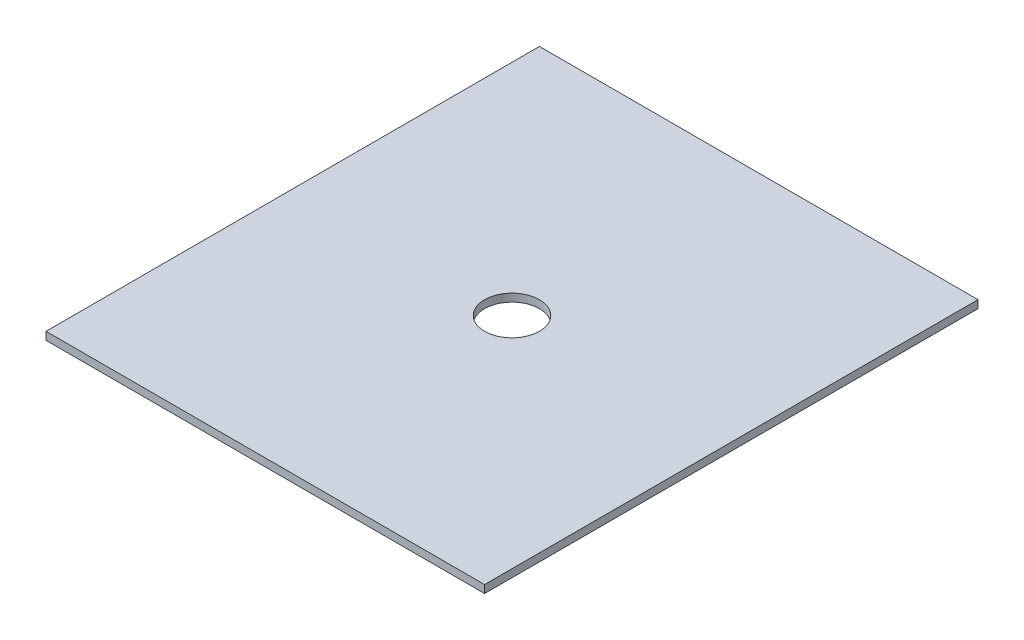
ISO-10303-21;
HEADER;
FILE_DESCRIPTION(('STEP AP214'),'2;1');
FILE_NAME('part.step','',(''),(''),'','','');
FILE_SCHEMA(('AUTOMOTIVE_DESIGN { 1 0 10303 214 1 1 1 1 }'));
ENDSEC;
DATA;
#1=APPLICATION_CONTEXT('core data for automotive mechanical design processes');
#2=APPLICATION_PROTOCOL_DEFINITION('international standard','automotive_design',2000,#1);
#3=PRODUCT_CONTEXT('',#1,'mechanical');
#4=PRODUCT('Part','Part','',(#3));
#5=PRODUCT_RELATED_PRODUCT_CATEGORY('part','',(#4));
#6=PRODUCT_DEFINITION_FORMATION('','',#4);
#7=PRODUCT_DEFINITION_CONTEXT('part definition',#1,'design');
#8=PRODUCT_DEFINITION('design','',#6,#7);
#9=PRODUCT_DEFINITION_SHAPE('','',#8);
#10=(LENGTH_UNIT() NAMED_UNIT(*) SI_UNIT(.MILLI.,.METRE.));
#11=(NAMED_UNIT(*) PLANE_ANGLE_UNIT() SI_UNIT($,.RADIAN.));
#12=(NAMED_UNIT(*) SI_UNIT($,.STERADIAN.) SOLID_ANGLE_UNIT());
#13=UNCERTAINTY_MEASURE_WITH_UNIT(LENGTH_MEASURE(1.E-05),#10,'distance_accuracy_value','');
#14=(GEOMETRIC_REPRESENTATION_CONTEXT(3) GLOBAL_UNCERTAINTY_ASSIGNED_CONTEXT((#13)) GLOBAL_UNIT_ASSIGNED_CONTEXT((#10,
#11,#12)) REPRESENTATION_CONTEXT('',''));
#15=CARTESIAN_POINT('',(0.,0.,0.));
#16=DIRECTION('',(0.,0.,1.));
#17=DIRECTION('',(1.,0.,0.));
#18=AXIS2_PLACEMENT_3D('',#15,#16,#17);
#19=CARTESIAN_POINT('',(0.,6.35,0.));
#20=DIRECTION('',(0.,-1.,0.));
#21=DIRECTION('',(0.,0.,-1.));
#22=AXIS2_PLACEMENT_3D('',#19,#20,#21);
#23=PLANE('',#22);
#24=DIRECTION('',(0.,0.,1.));
#25=VECTOR('',#24,1.);
#26=CARTESIAN_POINT('',(0.,6.35,0.));
#27=LINE('',#26,#25);
#28=CARTESIAN_POINT('',(0.,6.35,-400.05));
#29=VERTEX_POINT('',#28);
#30=CARTESIAN_POINT('',(0.,6.35,0.));
#31=VERTEX_POINT('',#30);
#32=EDGE_CURVE('E89',#29,#31,#27,.T.);
#33=ORIENTED_EDGE('',*,*,#32,.T.);
#34=DIRECTION('',(1.,0.,0.));
#35=VECTOR('',#34,1.);
#36=CARTESIAN_POINT('',(0.,6.35,0.));
#37=LINE('',#36,#35);
#38=CARTESIAN_POINT('',(355.6,6.35,0.));
#39=VERTEX_POINT('',#38);
#40=EDGE_CURVE('E84',#31,#39,#37,.T.);
#41=ORIENTED_EDGE('',*,*,#40,.T.);
#42=DIRECTION('',(0.,0.,-1.));
#43=VECTOR('',#42,1.);
#44=CARTESIAN_POINT('',(355.6,6.35,0.));
#45=LINE('',#44,#43);
#46=CARTESIAN_POINT('',(355.6,6.35,-400.05));
#47=VERTEX_POINT('',#46);
#48=EDGE_CURVE('E87',#39,#47,#45,.T.);
#49=ORIENTED_EDGE('',*,*,#48,.T.);
#50=DIRECTION('',(-1.,0.,0.));
#51=VECTOR('',#50,1.);
#52=CARTESIAN_POINT('',(0.,6.35,-400.05));
#53=LINE('',#52,#51);
#54=EDGE_CURVE('E54',#47,#29,#53,.T.);
#55=ORIENTED_EDGE('',*,*,#54,.T.);
#56=EDGE_LOOP('',(#33,#41,#49,#55));
#57=FACE_BOUND('',#56,.T.);
#58=CARTESIAN_POINT('',(177.8,6.35,-200.025));
#59=DIRECTION('',(0.,1.,0.));
#60=DIRECTION('',(0.,0.,1.));
#61=AXIS2_PLACEMENT_3D('',#58,#59,#60);
#62=CIRCLE('',#61,22.225);
#63=CARTESIAN_POINT('',(177.8,6.35,-177.8));
#64=VERTEX_POINT('',#63);
#65=EDGE_CURVE('E104',#64,#64,#62,.T.);
#66=ORIENTED_EDGE('',*,*,#65,.F.);
#67=EDGE_LOOP('',(#66));
#68=FACE_BOUND('',#67,.T.);
#69=ADVANCED_FACE('F37',(#57,#68),#23,.F.);
#70=CARTESIAN_POINT('',(0.,0.,0.));
#71=DIRECTION('',(0.,-1.,0.));
#72=DIRECTION('',(0.,0.,-1.));
#73=AXIS2_PLACEMENT_3D('',#70,#71,#72);
#74=PLANE('',#73);
#75=DIRECTION('',(0.,0.,1.));
#76=VECTOR('',#75,1.);
#77=CARTESIAN_POINT('',(0.,0.,0.));
#78=LINE('',#77,#76);
#79=CARTESIAN_POINT('',(0.,0.,-400.05));
#80=VERTEX_POINT('',#79);
#81=CARTESIAN_POINT('',(0.,0.,0.));
#82=VERTEX_POINT('',#81);
#83=EDGE_CURVE('E101',#80,#82,#78,.T.);
#84=ORIENTED_EDGE('',*,*,#83,.F.);
#85=DIRECTION('',(-1.,0.,0.));
#86=VECTOR('',#85,1.);
#87=CARTESIAN_POINT('',(0.,0.,-400.05));
#88=LINE('',#87,#86);
#89=CARTESIAN_POINT('',(355.6,0.,-400.05));
#90=VERTEX_POINT('',#89);
#91=EDGE_CURVE('E77',#90,#80,#88,.T.);
#92=ORIENTED_EDGE('',*,*,#91,.F.);
#93=DIRECTION('',(0.,0.,-1.));
#94=VECTOR('',#93,1.);
#95=CARTESIAN_POINT('',(355.6,0.,0.));
#96=LINE('',#95,#94);
#97=CARTESIAN_POINT('',(355.6,0.,0.));
#98=VERTEX_POINT('',#97);
#99=EDGE_CURVE('E71',#98,#90,#96,.T.);
#100=ORIENTED_EDGE('',*,*,#99,.F.);
#101=DIRECTION('',(1.,0.,0.));
#102=VECTOR('',#101,1.);
#103=CARTESIAN_POINT('',(0.,0.,0.));
#104=LINE('',#103,#102);
#105=EDGE_CURVE('E93',#82,#98,#104,.T.);
#106=ORIENTED_EDGE('',*,*,#105,.F.);
#107=EDGE_LOOP('',(#84,#92,#100,#106));
#108=FACE_BOUND('',#107,.T.);
#109=CARTESIAN_POINT('',(177.8,0.,-200.025));
#110=DIRECTION('',(0.,1.,0.));
#111=DIRECTION('',(0.,0.,1.));
#112=AXIS2_PLACEMENT_3D('',#109,#110,#111);
#113=CIRCLE('',#112,22.225);
#114=CARTESIAN_POINT('',(177.8,0.,-177.8));
#115=VERTEX_POINT('',#114);
#116=EDGE_CURVE('E116',#115,#115,#113,.T.);
#117=ORIENTED_EDGE('',*,*,#116,.T.);
#118=EDGE_LOOP('',(#117));
#119=FACE_BOUND('',#118,.T.);
#120=ADVANCED_FACE('F112',(#108,#119),#74,.T.);
#121=CARTESIAN_POINT('',(0.,6.35,0.));
#122=DIRECTION('',(1.,0.,0.));
#123=DIRECTION('',(0.,0.,-1.));
#124=AXIS2_PLACEMENT_3D('',#121,#122,#123);
#125=PLANE('',#124);
#126=ORIENTED_EDGE('',*,*,#83,.T.);
#127=DIRECTION('',(0.,-1.,0.));
#128=VECTOR('',#127,1.);
#129=CARTESIAN_POINT('',(0.,6.35,0.));
#130=LINE('',#129,#128);
#131=EDGE_CURVE('E11',#31,#82,#130,.T.);
#132=ORIENTED_EDGE('',*,*,#131,.F.);
#133=ORIENTED_EDGE('',*,*,#32,.F.);
#134=DIRECTION('',(0.,-1.,0.));
#135=VECTOR('',#134,1.);
#136=CARTESIAN_POINT('',(0.,6.35,-400.05));
#137=LINE('',#136,#135);
#138=EDGE_CURVE('E97',#29,#80,#137,.T.);
#139=ORIENTED_EDGE('',*,*,#138,.T.);
#140=EDGE_LOOP('',(#126,#132,#133,#139));
#141=FACE_BOUND('',#140,.T.);
#142=ADVANCED_FACE('F39',(#141),#125,.F.);
#143=CARTESIAN_POINT('',(0.,6.35,0.));
#144=DIRECTION('',(0.,0.,-1.));
#145=DIRECTION('',(-1.,0.,0.));
#146=AXIS2_PLACEMENT_3D('',#143,#144,#145);
#147=PLANE('',#146);
#148=ORIENTED_EDGE('',*,*,#105,.T.);
#149=DIRECTION('',(0.,-1.,0.));
#150=VECTOR('',#149,1.);
#151=CARTESIAN_POINT('',(355.6,6.35,0.));
#152=LINE('',#151,#150);
#153=EDGE_CURVE('E46',#39,#98,#152,.T.);
#154=ORIENTED_EDGE('',*,*,#153,.F.);
#155=ORIENTED_EDGE('',*,*,#40,.F.);
#156=ORIENTED_EDGE('',*,*,#131,.T.);
#157=EDGE_LOOP('',(#148,#154,#155,#156));
#158=FACE_BOUND('',#157,.T.);
#159=ADVANCED_FACE('F92',(#158),#147,.F.);
#160=CARTESIAN_POINT('',(355.6,6.35,0.));
#161=DIRECTION('',(-1.,0.,0.));
#162=DIRECTION('',(0.,0.,1.));
#163=AXIS2_PLACEMENT_3D('',#160,#161,#162);
#164=PLANE('',#163);
#165=ORIENTED_EDGE('',*,*,#99,.T.);
#166=DIRECTION('',(0.,-1.,0.));
#167=VECTOR('',#166,1.);
#168=CARTESIAN_POINT('',(355.6,6.35,-400.05));
#169=LINE('',#168,#167);
#170=EDGE_CURVE('E94',#47,#90,#169,.T.);
#171=ORIENTED_EDGE('',*,*,#170,.F.);
#172=ORIENTED_EDGE('',*,*,#48,.F.);
#173=ORIENTED_EDGE('',*,*,#153,.T.);
#174=EDGE_LOOP('',(#165,#171,#172,#173));
#175=FACE_BOUND('',#174,.T.);
#176=ADVANCED_FACE('F95',(#175),#164,.F.);
#177=CARTESIAN_POINT('',(0.,6.35,-400.05));
#178=DIRECTION('',(0.,0.,1.));
#179=DIRECTION('',(1.,0.,0.));
#180=AXIS2_PLACEMENT_3D('',#177,#178,#179);
#181=PLANE('',#180);
#182=ORIENTED_EDGE('',*,*,#91,.T.);
#183=ORIENTED_EDGE('',*,*,#138,.F.);
#184=ORIENTED_EDGE('',*,*,#54,.F.);
#185=ORIENTED_EDGE('',*,*,#170,.T.);
#186=EDGE_LOOP('',(#182,#183,#184,#185));
#187=FACE_BOUND('',#186,.T.);
#188=ADVANCED_FACE('F109',(#187),#181,.F.);
#189=CARTESIAN_POINT('',(177.8,6.35,-200.025));
#190=DIRECTION('',(0.,-1.,0.));
#191=DIRECTION('',(0.,0.,-1.));
#192=AXIS2_PLACEMENT_3D('',#189,#190,#191);
#193=CYLINDRICAL_SURFACE('',#192,22.225);
#194=ORIENTED_EDGE('',*,*,#65,.T.);
#195=EDGE_LOOP('',(#194));
#196=FACE_BOUND('',#195,.T.);
#197=ORIENTED_EDGE('',*,*,#116,.F.);
#198=EDGE_LOOP('',(#197));
#199=FACE_BOUND('',#198,.T.);
#200=ADVANCED_FACE('F122',(#196,#199),#193,.F.);
#201=CLOSED_SHELL('',(#69,#120,#142,#159,#176,#188,#200));
#202=MANIFOLD_SOLID_BREP('B2',#201);
#203=ADVANCED_BREP_SHAPE_REPRESENTATION('',(#18,#202),#14);
#204=SHAPE_DEFINITION_REPRESENTATION(#9,#203);
ENDSEC;
END-ISO-10303-21;
